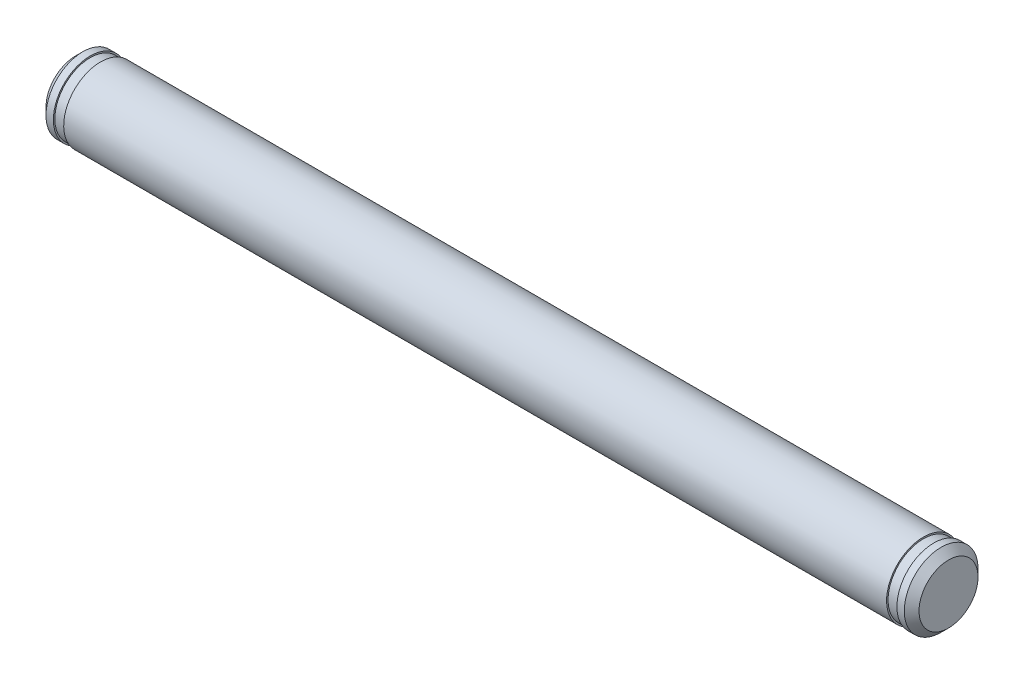
ISO-10303-21;
HEADER;
FILE_DESCRIPTION(('STEP AP214'),'2;1');
FILE_NAME('part.step','',(''),(''),'','','');
FILE_SCHEMA(('AUTOMOTIVE_DESIGN { 1 0 10303 214 1 1 1 1 }'));
ENDSEC;
DATA;
#1=APPLICATION_CONTEXT('core data for automotive mechanical design processes');
#2=APPLICATION_PROTOCOL_DEFINITION('international standard','automotive_design',2000,#1);
#3=PRODUCT_CONTEXT('',#1,'mechanical');
#4=PRODUCT('Part','Part','',(#3));
#5=PRODUCT_RELATED_PRODUCT_CATEGORY('part','',(#4));
#6=PRODUCT_DEFINITION_FORMATION('','',#4);
#7=PRODUCT_DEFINITION_CONTEXT('part definition',#1,'design');
#8=PRODUCT_DEFINITION('design','',#6,#7);
#9=PRODUCT_DEFINITION_SHAPE('','',#8);
#10=(LENGTH_UNIT() NAMED_UNIT(*) SI_UNIT(.MILLI.,.METRE.));
#11=(NAMED_UNIT(*) PLANE_ANGLE_UNIT() SI_UNIT($,.RADIAN.));
#12=(NAMED_UNIT(*) SI_UNIT($,.STERADIAN.) SOLID_ANGLE_UNIT());
#13=UNCERTAINTY_MEASURE_WITH_UNIT(LENGTH_MEASURE(1.E-05),#10,'distance_accuracy_value','');
#14=(GEOMETRIC_REPRESENTATION_CONTEXT(3) GLOBAL_UNCERTAINTY_ASSIGNED_CONTEXT((#13)) GLOBAL_UNIT_ASSIGNED_CONTEXT((#10,
#11,#12)) REPRESENTATION_CONTEXT('',''));
#15=CARTESIAN_POINT('',(0.,0.,0.));
#16=DIRECTION('',(0.,0.,1.));
#17=DIRECTION('',(1.,0.,0.));
#18=AXIS2_PLACEMENT_3D('',#15,#16,#17);
#19=CARTESIAN_POINT('',(-29.6,0.,0.));
#20=DIRECTION('',(-1.,0.,0.));
#21=DIRECTION('',(0.,-1.,0.));
#22=AXIS2_PLACEMENT_3D('',#19,#20,#21);
#23=PLANE('',#22);
#24=CARTESIAN_POINT('',(-29.6,0.,0.));
#25=DIRECTION('',(-1.,0.,0.));
#26=DIRECTION('',(0.,-1.,0.));
#27=AXIS2_PLACEMENT_3D('',#24,#25,#26);
#28=CIRCLE('',#27,1.99999999999999);
#29=CARTESIAN_POINT('',(-29.6,-2.,0.));
#30=VERTEX_POINT('',#29);
#31=EDGE_CURVE('E10',#30,#30,#28,.T.);
#32=ORIENTED_EDGE('',*,*,#31,.T.);
#33=EDGE_LOOP('',(#32));
#34=FACE_BOUND('',#33,.T.);
#35=ADVANCED_FACE('F34',(#34),#23,.T.);
#36=CARTESIAN_POINT('',(29.6,0.,0.));
#37=DIRECTION('',(1.,0.,0.));
#38=DIRECTION('',(0.,1.,0.));
#39=AXIS2_PLACEMENT_3D('',#36,#37,#38);
#40=CYLINDRICAL_SURFACE('',#39,2.5);
#41=CARTESIAN_POINT('',(-29.1,0.,0.));
#42=DIRECTION('',(-1.,0.,0.));
#43=DIRECTION('',(0.,-1.,0.));
#44=AXIS2_PLACEMENT_3D('',#41,#42,#43);
#45=CIRCLE('',#44,2.5);
#46=CARTESIAN_POINT('',(-29.1,-2.5,0.));
#47=VERTEX_POINT('',#46);
#48=EDGE_CURVE('E42',#47,#47,#45,.F.);
#49=ORIENTED_EDGE('',*,*,#48,.T.);
#50=EDGE_LOOP('',(#49));
#51=FACE_BOUND('',#50,.T.);
#52=CARTESIAN_POINT('',(-28.6,0.,0.));
#53=DIRECTION('',(1.,0.,0.));
#54=DIRECTION('',(0.,1.,0.));
#55=AXIS2_PLACEMENT_3D('',#52,#53,#54);
#56=CIRCLE('',#55,2.5);
#57=CARTESIAN_POINT('',(-28.6,2.49999999999999,0.));
#58=VERTEX_POINT('',#57);
#59=EDGE_CURVE('E55',#58,#58,#56,.T.);
#60=ORIENTED_EDGE('',*,*,#59,.F.);
#61=EDGE_LOOP('',(#60));
#62=FACE_BOUND('',#61,.T.);
#63=ADVANCED_FACE('F98',(#51,#62),#40,.T.);
#64=CARTESIAN_POINT('',(-28.6,2.49999999999999,0.));
#65=DIRECTION('',(1.,0.,0.));
#66=DIRECTION('',(0.,1.,0.));
#67=AXIS2_PLACEMENT_3D('',#64,#65,#66);
#68=PLANE('',#67);
#69=ORIENTED_EDGE('',*,*,#59,.T.);
#70=EDGE_LOOP('',(#69));
#71=FACE_BOUND('',#70,.T.);
#72=CARTESIAN_POINT('',(-28.6,0.,0.));
#73=DIRECTION('',(1.,0.,0.));
#74=DIRECTION('',(0.,1.,0.));
#75=AXIS2_PLACEMENT_3D('',#72,#73,#74);
#76=CIRCLE('',#75,2.4);
#77=CARTESIAN_POINT('',(-28.6,2.39999999999999,0.));
#78=VERTEX_POINT('',#77);
#79=EDGE_CURVE('E58',#78,#78,#76,.T.);
#80=ORIENTED_EDGE('',*,*,#79,.F.);
#81=EDGE_LOOP('',(#80));
#82=FACE_BOUND('',#81,.T.);
#83=ADVANCED_FACE('F103',(#71,#82),#68,.T.);
#84=CARTESIAN_POINT('',(29.6,0.,0.));
#85=DIRECTION('',(1.,0.,0.));
#86=DIRECTION('',(0.,1.,0.));
#87=AXIS2_PLACEMENT_3D('',#84,#85,#86);
#88=CYLINDRICAL_SURFACE('',#87,2.4);
#89=ORIENTED_EDGE('',*,*,#79,.T.);
#90=EDGE_LOOP('',(#89));
#91=FACE_BOUND('',#90,.T.);
#92=CARTESIAN_POINT('',(-27.9,0.,0.));
#93=DIRECTION('',(1.,0.,0.));
#94=DIRECTION('',(0.,1.,0.));
#95=AXIS2_PLACEMENT_3D('',#92,#93,#94);
#96=CIRCLE('',#95,2.4);
#97=CARTESIAN_POINT('',(-27.9,2.39999999999999,0.));
#98=VERTEX_POINT('',#97);
#99=EDGE_CURVE('E61',#98,#98,#96,.T.);
#100=ORIENTED_EDGE('',*,*,#99,.F.);
#101=EDGE_LOOP('',(#100));
#102=FACE_BOUND('',#101,.T.);
#103=ADVANCED_FACE('F179',(#91,#102),#88,.T.);
#104=CARTESIAN_POINT('',(-27.9,2.39999999999999,0.));
#105=DIRECTION('',(-1.,0.,0.));
#106=DIRECTION('',(0.,-1.,0.));
#107=AXIS2_PLACEMENT_3D('',#104,#105,#106);
#108=PLANE('',#107);
#109=ORIENTED_EDGE('',*,*,#99,.T.);
#110=EDGE_LOOP('',(#109));
#111=FACE_BOUND('',#110,.T.);
#112=CARTESIAN_POINT('',(-27.9,0.,0.));
#113=DIRECTION('',(1.,0.,0.));
#114=DIRECTION('',(0.,1.,0.));
#115=AXIS2_PLACEMENT_3D('',#112,#113,#114);
#116=CIRCLE('',#115,2.5);
#117=CARTESIAN_POINT('',(-27.9,2.49999999999999,0.));
#118=VERTEX_POINT('',#117);
#119=EDGE_CURVE('E64',#118,#118,#116,.T.);
#120=ORIENTED_EDGE('',*,*,#119,.F.);
#121=EDGE_LOOP('',(#120));
#122=FACE_BOUND('',#121,.T.);
#123=ADVANCED_FACE('F169',(#111,#122),#108,.T.);
#124=CARTESIAN_POINT('',(29.6,0.,0.));
#125=DIRECTION('',(1.,0.,0.));
#126=DIRECTION('',(0.,1.,0.));
#127=AXIS2_PLACEMENT_3D('',#124,#125,#126);
#128=CYLINDRICAL_SURFACE('',#127,2.5);
#129=ORIENTED_EDGE('',*,*,#119,.T.);
#130=EDGE_LOOP('',(#129));
#131=FACE_BOUND('',#130,.T.);
#132=CARTESIAN_POINT('',(27.9,0.,0.));
#133=DIRECTION('',(1.,0.,0.));
#134=DIRECTION('',(0.,1.,0.));
#135=AXIS2_PLACEMENT_3D('',#132,#133,#134);
#136=CIRCLE('',#135,2.5);
#137=CARTESIAN_POINT('',(27.9,2.5,0.));
#138=VERTEX_POINT('',#137);
#139=EDGE_CURVE('E67',#138,#138,#136,.T.);
#140=ORIENTED_EDGE('',*,*,#139,.F.);
#141=EDGE_LOOP('',(#140));
#142=FACE_BOUND('',#141,.T.);
#143=ADVANCED_FACE('F159',(#131,#142),#128,.T.);
#144=CARTESIAN_POINT('',(27.9,2.4,0.));
#145=DIRECTION('',(1.,0.,0.));
#146=DIRECTION('',(0.,1.,0.));
#147=AXIS2_PLACEMENT_3D('',#144,#145,#146);
#148=PLANE('',#147);
#149=ORIENTED_EDGE('',*,*,#139,.T.);
#150=EDGE_LOOP('',(#149));
#151=FACE_BOUND('',#150,.T.);
#152=CARTESIAN_POINT('',(27.9,0.,0.));
#153=DIRECTION('',(1.,0.,0.));
#154=DIRECTION('',(0.,1.,0.));
#155=AXIS2_PLACEMENT_3D('',#152,#153,#154);
#156=CIRCLE('',#155,2.4);
#157=CARTESIAN_POINT('',(27.9,2.4,0.));
#158=VERTEX_POINT('',#157);
#159=EDGE_CURVE('E70',#158,#158,#156,.T.);
#160=ORIENTED_EDGE('',*,*,#159,.F.);
#161=EDGE_LOOP('',(#160));
#162=FACE_BOUND('',#161,.T.);
#163=ADVANCED_FACE('F94',(#151,#162),#148,.T.);
#164=CARTESIAN_POINT('',(29.6,0.,0.));
#165=DIRECTION('',(1.,0.,0.));
#166=DIRECTION('',(0.,1.,0.));
#167=AXIS2_PLACEMENT_3D('',#164,#165,#166);
#168=CYLINDRICAL_SURFACE('',#167,2.4);
#169=ORIENTED_EDGE('',*,*,#159,.T.);
#170=EDGE_LOOP('',(#169));
#171=FACE_BOUND('',#170,.T.);
#172=CARTESIAN_POINT('',(28.6,0.,0.));
#173=DIRECTION('',(1.,0.,0.));
#174=DIRECTION('',(0.,1.,0.));
#175=AXIS2_PLACEMENT_3D('',#172,#173,#174);
#176=CIRCLE('',#175,2.4);
#177=CARTESIAN_POINT('',(28.6,2.4,0.));
#178=VERTEX_POINT('',#177);
#179=EDGE_CURVE('E73',#178,#178,#176,.T.);
#180=ORIENTED_EDGE('',*,*,#179,.F.);
#181=EDGE_LOOP('',(#180));
#182=FACE_BOUND('',#181,.T.);
#183=ADVANCED_FACE('F84',(#171,#182),#168,.T.);
#184=CARTESIAN_POINT('',(28.6,2.5,0.));
#185=DIRECTION('',(-1.,0.,0.));
#186=DIRECTION('',(0.,-1.,0.));
#187=AXIS2_PLACEMENT_3D('',#184,#185,#186);
#188=PLANE('',#187);
#189=ORIENTED_EDGE('',*,*,#179,.T.);
#190=EDGE_LOOP('',(#189));
#191=FACE_BOUND('',#190,.T.);
#192=CARTESIAN_POINT('',(28.6,0.,0.));
#193=DIRECTION('',(1.,0.,0.));
#194=DIRECTION('',(0.,1.,0.));
#195=AXIS2_PLACEMENT_3D('',#192,#193,#194);
#196=CIRCLE('',#195,2.5);
#197=CARTESIAN_POINT('',(28.6,2.5,0.));
#198=VERTEX_POINT('',#197);
#199=EDGE_CURVE('E76',#198,#198,#196,.T.);
#200=ORIENTED_EDGE('',*,*,#199,.F.);
#201=EDGE_LOOP('',(#200));
#202=FACE_BOUND('',#201,.T.);
#203=ADVANCED_FACE('F82',(#191,#202),#188,.T.);
#204=CARTESIAN_POINT('',(29.6,0.,0.));
#205=DIRECTION('',(1.,0.,0.));
#206=DIRECTION('',(0.,1.,0.));
#207=AXIS2_PLACEMENT_3D('',#204,#205,#206);
#208=CYLINDRICAL_SURFACE('',#207,2.5);
#209=CARTESIAN_POINT('',(29.1,0.,0.));
#210=DIRECTION('',(1.,0.,0.));
#211=DIRECTION('',(0.,1.,0.));
#212=AXIS2_PLACEMENT_3D('',#209,#210,#211);
#213=CIRCLE('',#212,2.5);
#214=CARTESIAN_POINT('',(29.1,2.5,0.));
#215=VERTEX_POINT('',#214);
#216=EDGE_CURVE('E46',#215,#215,#213,.F.);
#217=ORIENTED_EDGE('',*,*,#216,.T.);
#218=EDGE_LOOP('',(#217));
#219=FACE_BOUND('',#218,.T.);
#220=ORIENTED_EDGE('',*,*,#199,.T.);
#221=EDGE_LOOP('',(#220));
#222=FACE_BOUND('',#221,.T.);
#223=ADVANCED_FACE('F80',(#219,#222),#208,.T.);
#224=CARTESIAN_POINT('',(29.6,0.,0.));
#225=DIRECTION('',(1.,0.,0.));
#226=DIRECTION('',(0.,1.,0.));
#227=AXIS2_PLACEMENT_3D('',#224,#225,#226);
#228=PLANE('',#227);
#229=CARTESIAN_POINT('',(29.6,0.,0.));
#230=DIRECTION('',(1.,0.,0.));
#231=DIRECTION('',(0.,1.,0.));
#232=AXIS2_PLACEMENT_3D('',#229,#230,#231);
#233=CIRCLE('',#232,2.00000000000001);
#234=CARTESIAN_POINT('',(29.6,2.00000000000001,0.));
#235=VERTEX_POINT('',#234);
#236=EDGE_CURVE('E50',#235,#235,#233,.T.);
#237=ORIENTED_EDGE('',*,*,#236,.T.);
#238=EDGE_LOOP('',(#237));
#239=FACE_BOUND('',#238,.T.);
#240=ADVANCED_FACE('F91',(#239),#228,.T.);
#241=CARTESIAN_POINT('',(29.6,0.,0.));
#242=DIRECTION('',(-1.,0.,0.));
#243=DIRECTION('',(0.,-1.,0.));
#244=AXIS2_PLACEMENT_3D('',#241,#242,#243);
#245=CONICAL_SURFACE('',#244,2.00000000000001,0.785398163397448);
#246=ORIENTED_EDGE('',*,*,#216,.F.);
#247=EDGE_LOOP('',(#246));
#248=FACE_BOUND('',#247,.T.);
#249=ORIENTED_EDGE('',*,*,#236,.F.);
#250=EDGE_LOOP('',(#249));
#251=FACE_BOUND('',#250,.T.);
#252=ADVANCED_FACE('F107',(#248,#251),#245,.T.);
#253=CARTESIAN_POINT('',(-29.1,0.,0.));
#254=DIRECTION('',(1.,0.,0.));
#255=DIRECTION('',(0.,1.,0.));
#256=AXIS2_PLACEMENT_3D('',#253,#254,#255);
#257=CONICAL_SURFACE('',#256,2.5,0.785398163397451);
#258=ORIENTED_EDGE('',*,*,#31,.F.);
#259=EDGE_LOOP('',(#258));
#260=FACE_BOUND('',#259,.T.);
#261=ORIENTED_EDGE('',*,*,#48,.F.);
#262=EDGE_LOOP('',(#261));
#263=FACE_BOUND('',#262,.T.);
#264=ADVANCED_FACE('F37',(#260,#263),#257,.T.);
#265=CLOSED_SHELL('',(#35,#63,#83,#103,#123,#143,#163,#183,#203,#223,#240,#252,#264));
#266=MANIFOLD_SOLID_BREP('B2',#265);
#267=ADVANCED_BREP_SHAPE_REPRESENTATION('',(#18,#266),#14);
#268=SHAPE_DEFINITION_REPRESENTATION(#9,#267);
ENDSEC;
END-ISO-10303-21;
